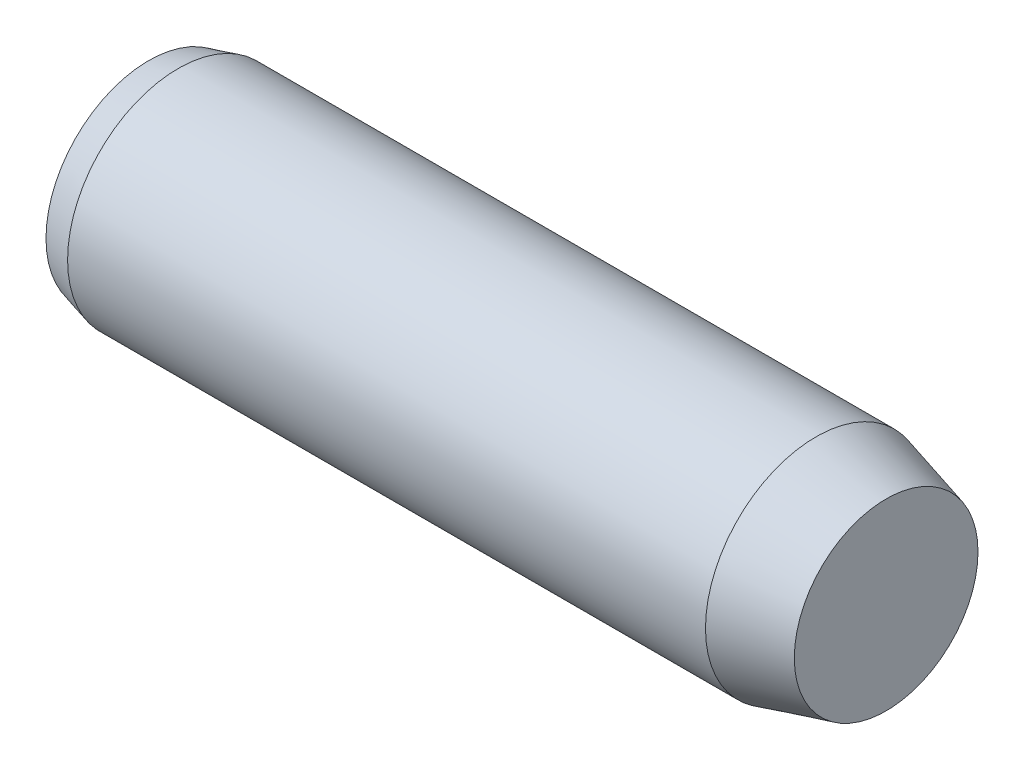
ISO-10303-21;
HEADER;
FILE_DESCRIPTION(('STEP AP214'),'2;1');
FILE_NAME('part.step','',(''),(''),'','','');
FILE_SCHEMA(('AUTOMOTIVE_DESIGN { 1 0 10303 214 1 1 1 1 }'));
ENDSEC;
DATA;
#1=APPLICATION_CONTEXT('core data for automotive mechanical design processes');
#2=APPLICATION_PROTOCOL_DEFINITION('international standard','automotive_design',2000,#1);
#3=PRODUCT_CONTEXT('',#1,'mechanical');
#4=PRODUCT('Part','Part','',(#3));
#5=PRODUCT_RELATED_PRODUCT_CATEGORY('part','',(#4));
#6=PRODUCT_DEFINITION_FORMATION('','',#4);
#7=PRODUCT_DEFINITION_CONTEXT('part definition',#1,'design');
#8=PRODUCT_DEFINITION('design','',#6,#7);
#9=PRODUCT_DEFINITION_SHAPE('','',#8);
#10=(LENGTH_UNIT() NAMED_UNIT(*) SI_UNIT(.MILLI.,.METRE.));
#11=(NAMED_UNIT(*) PLANE_ANGLE_UNIT() SI_UNIT($,.RADIAN.));
#12=(NAMED_UNIT(*) SI_UNIT($,.STERADIAN.) SOLID_ANGLE_UNIT());
#13=UNCERTAINTY_MEASURE_WITH_UNIT(LENGTH_MEASURE(1.E-05),#10,'distance_accuracy_value','');
#14=(GEOMETRIC_REPRESENTATION_CONTEXT(3) GLOBAL_UNCERTAINTY_ASSIGNED_CONTEXT((#13)) GLOBAL_UNIT_ASSIGNED_CONTEXT((#10,
#11,#12)) REPRESENTATION_CONTEXT('',''));
#15=CARTESIAN_POINT('',(0.,0.,0.));
#16=DIRECTION('',(0.,0.,1.));
#17=DIRECTION('',(1.,0.,0.));
#18=AXIS2_PLACEMENT_3D('',#15,#16,#17);
#19=CARTESIAN_POINT('',(0.,0.,0.));
#20=DIRECTION('',(1.,0.,0.));
#21=DIRECTION('',(0.,0.,-1.));
#22=AXIS2_PLACEMENT_3D('',#19,#20,#21);
#23=PLANE('',#22);
#24=CARTESIAN_POINT('',(0.,0.,0.));
#25=DIRECTION('',(-1.,0.,0.));
#26=DIRECTION('',(0.,0.,1.));
#27=AXIS2_PLACEMENT_3D('',#24,#25,#26);
#28=CIRCLE('',#27,3.025);
#29=CARTESIAN_POINT('',(0.,0.,3.025));
#30=VERTEX_POINT('',#29);
#31=EDGE_CURVE('E65',#30,#30,#28,.T.);
#32=ORIENTED_EDGE('',*,*,#31,.F.);
#33=EDGE_LOOP('',(#32));
#34=FACE_BOUND('',#33,.T.);
#35=CARTESIAN_POINT('',(0.,0.,0.));
#36=DIRECTION('',(-1.,0.,0.));
#37=DIRECTION('',(0.,0.,1.));
#38=AXIS2_PLACEMENT_3D('',#35,#36,#37);
#39=CIRCLE('',#38,5.5712812921102);
#40=CARTESIAN_POINT('',(0.,0.,5.5712812921102));
#41=VERTEX_POINT('',#40);
#42=EDGE_CURVE('E11',#41,#41,#39,.T.);
#43=ORIENTED_EDGE('',*,*,#42,.T.);
#44=EDGE_LOOP('',(#43));
#45=FACE_BOUND('',#44,.T.);
#46=ADVANCED_FACE('F39',(#34,#45),#23,.F.);
#47=CARTESIAN_POINT('',(1.6,0.,0.));
#48=DIRECTION('',(1.,0.,0.));
#49=DIRECTION('',(0.,0.,-1.));
#50=AXIS2_PLACEMENT_3D('',#47,#48,#49);
#51=CONICAL_SURFACE('',#50,6.,0.26179938779915);
#52=ORIENTED_EDGE('',*,*,#42,.F.);
#53=EDGE_LOOP('',(#52));
#54=FACE_BOUND('',#53,.T.);
#55=CARTESIAN_POINT('',(1.6,0.,0.));
#56=DIRECTION('',(-1.,0.,0.));
#57=DIRECTION('',(0.,0.,1.));
#58=AXIS2_PLACEMENT_3D('',#55,#56,#57);
#59=CIRCLE('',#58,6.);
#60=CARTESIAN_POINT('',(1.6,0.,6.));
#61=VERTEX_POINT('',#60);
#62=EDGE_CURVE('E45',#61,#61,#59,.T.);
#63=ORIENTED_EDGE('',*,*,#62,.T.);
#64=EDGE_LOOP('',(#63));
#65=FACE_BOUND('',#64,.T.);
#66=ADVANCED_FACE('F73',(#54,#65),#51,.T.);
#67=CARTESIAN_POINT('',(0.,0.,0.));
#68=DIRECTION('',(-1.,0.,0.));
#69=DIRECTION('',(0.,0.,1.));
#70=AXIS2_PLACEMENT_3D('',#67,#68,#69);
#71=CYLINDRICAL_SURFACE('',#70,6.);
#72=ORIENTED_EDGE('',*,*,#62,.F.);
#73=EDGE_LOOP('',(#72));
#74=FACE_BOUND('',#73,.T.);
#75=CARTESIAN_POINT('',(36.2,0.,0.));
#76=DIRECTION('',(-1.,0.,0.));
#77=DIRECTION('',(0.,0.,1.));
#78=AXIS2_PLACEMENT_3D('',#75,#76,#77);
#79=CIRCLE('',#78,6.);
#80=CARTESIAN_POINT('',(36.2,0.,6.));
#81=VERTEX_POINT('',#80);
#82=EDGE_CURVE('E62',#81,#81,#79,.T.);
#83=ORIENTED_EDGE('',*,*,#82,.T.);
#84=EDGE_LOOP('',(#83));
#85=FACE_BOUND('',#84,.T.);
#86=ADVANCED_FACE('F75',(#74,#85),#71,.T.);
#87=CARTESIAN_POINT('',(40.,0.,0.));
#88=DIRECTION('',(-1.,0.,0.));
#89=DIRECTION('',(0.,0.,1.));
#90=AXIS2_PLACEMENT_3D('',#87,#88,#89);
#91=CONICAL_SURFACE('',#90,4.98179306876173,0.26179938779915);
#92=ORIENTED_EDGE('',*,*,#82,.F.);
#93=EDGE_LOOP('',(#92));
#94=FACE_BOUND('',#93,.T.);
#95=CARTESIAN_POINT('',(40.,0.,0.));
#96=DIRECTION('',(-1.,0.,0.));
#97=DIRECTION('',(0.,0.,1.));
#98=AXIS2_PLACEMENT_3D('',#95,#96,#97);
#99=CIRCLE('',#98,4.98179306876173);
#100=CARTESIAN_POINT('',(40.,0.,4.98179306876173));
#101=VERTEX_POINT('',#100);
#102=EDGE_CURVE('E58',#101,#101,#99,.T.);
#103=ORIENTED_EDGE('',*,*,#102,.T.);
#104=EDGE_LOOP('',(#103));
#105=FACE_BOUND('',#104,.T.);
#106=ADVANCED_FACE('F78',(#94,#105),#91,.T.);
#107=CARTESIAN_POINT('',(40.,4.98179306876173,0.));
#108=DIRECTION('',(-1.,0.,0.));
#109=DIRECTION('',(0.,0.,1.));
#110=AXIS2_PLACEMENT_3D('',#107,#108,#109);
#111=PLANE('',#110);
#112=ORIENTED_EDGE('',*,*,#102,.F.);
#113=EDGE_LOOP('',(#112));
#114=FACE_BOUND('',#113,.T.);
#115=ADVANCED_FACE('F52',(#114),#111,.F.);
#116=CARTESIAN_POINT('',(15.,0.,0.));
#117=DIRECTION('',(-1.,0.,0.));
#118=DIRECTION('',(0.,0.,1.));
#119=AXIS2_PLACEMENT_3D('',#116,#117,#118);
#120=CONICAL_SURFACE('',#119,2.5,1.02974425867665);
#121=CARTESIAN_POINT('',(16.5021515475689,0.,0.));
#122=VERTEX_POINT('',#121);
#123=VERTEX_LOOP('',#122);
#124=FACE_BOUND('',#123,.T.);
#125=CARTESIAN_POINT('',(15.,0.,0.));
#126=DIRECTION('',(-1.,0.,0.));
#127=DIRECTION('',(0.,0.,1.));
#128=AXIS2_PLACEMENT_3D('',#125,#126,#127);
#129=CIRCLE('',#128,2.5);
#130=CARTESIAN_POINT('',(15.,0.,2.5));
#131=VERTEX_POINT('',#130);
#132=EDGE_CURVE('E56',#131,#131,#129,.T.);
#133=ORIENTED_EDGE('',*,*,#132,.T.);
#134=EDGE_LOOP('',(#133));
#135=FACE_BOUND('',#134,.T.);
#136=ADVANCED_FACE('F48',(#124,#135),#120,.F.);
#137=CARTESIAN_POINT('',(0.,0.,0.));
#138=DIRECTION('',(-1.,0.,0.));
#139=DIRECTION('',(0.,0.,1.));
#140=AXIS2_PLACEMENT_3D('',#137,#138,#139);
#141=CYLINDRICAL_SURFACE('',#140,2.5);
#142=ORIENTED_EDGE('',*,*,#132,.F.);
#143=EDGE_LOOP('',(#142));
#144=FACE_BOUND('',#143,.T.);
#145=CARTESIAN_POINT('',(0.525000000000003,0.,0.));
#146=DIRECTION('',(-1.,0.,0.));
#147=DIRECTION('',(0.,0.,1.));
#148=AXIS2_PLACEMENT_3D('',#145,#146,#147);
#149=CIRCLE('',#148,2.5);
#150=CARTESIAN_POINT('',(0.525000000000003,0.,2.5));
#151=VERTEX_POINT('',#150);
#152=EDGE_CURVE('E59',#151,#151,#149,.T.);
#153=ORIENTED_EDGE('',*,*,#152,.T.);
#154=EDGE_LOOP('',(#153));
#155=FACE_BOUND('',#154,.T.);
#156=ADVANCED_FACE('F51',(#144,#155),#141,.F.);
#157=CARTESIAN_POINT('',(0.,0.,0.));
#158=DIRECTION('',(-1.,0.,0.));
#159=DIRECTION('',(0.,0.,1.));
#160=AXIS2_PLACEMENT_3D('',#157,#158,#159);
#161=CONICAL_SURFACE('',#160,3.025,0.785398163397447);
#162=ORIENTED_EDGE('',*,*,#152,.F.);
#163=EDGE_LOOP('',(#162));
#164=FACE_BOUND('',#163,.T.);
#165=ORIENTED_EDGE('',*,*,#31,.T.);
#166=EDGE_LOOP('',(#165));
#167=FACE_BOUND('',#166,.T.);
#168=ADVANCED_FACE('F102',(#164,#167),#161,.F.);
#169=CLOSED_SHELL('',(#46,#66,#86,#106,#115,#136,#156,#168));
#170=MANIFOLD_SOLID_BREP('B2',#169);
#171=ADVANCED_BREP_SHAPE_REPRESENTATION('',(#18,#170),#14);
#172=SHAPE_DEFINITION_REPRESENTATION(#9,#171);
ENDSEC;
END-ISO-10303-21;
